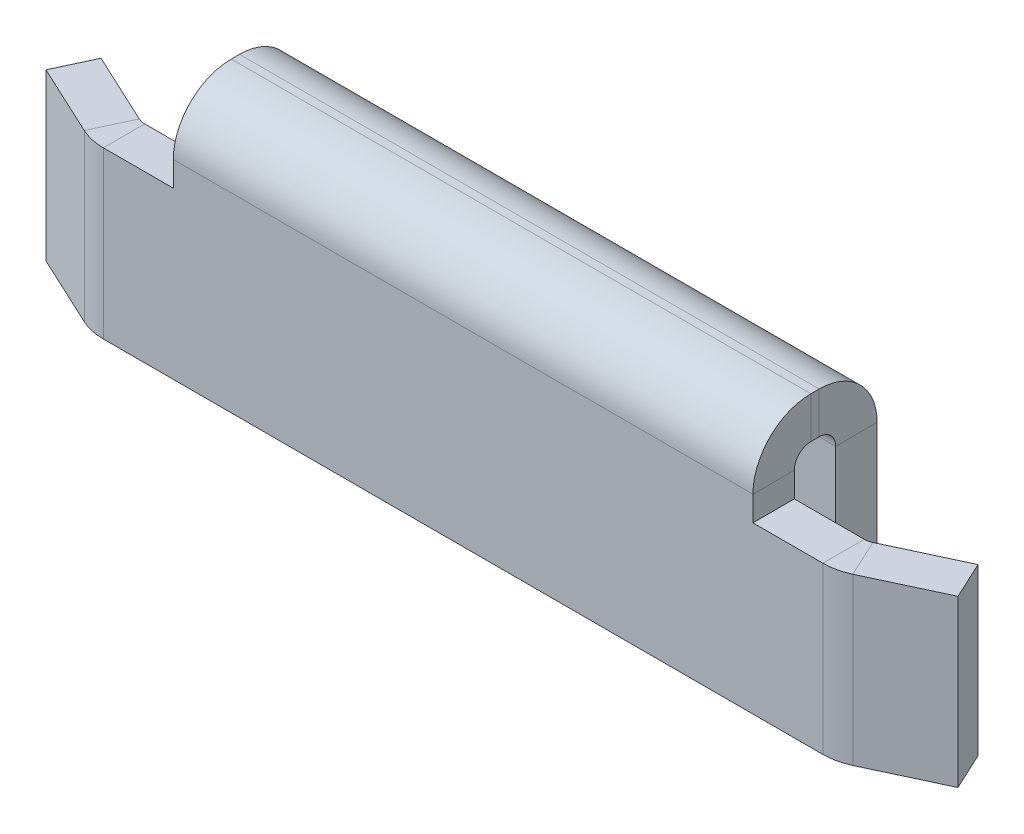
ISO-10303-21;
HEADER;
FILE_DESCRIPTION(('STEP AP214'),'2;1');
FILE_NAME('part.step','',(''),(''),'','','');
FILE_SCHEMA(('AUTOMOTIVE_DESIGN { 1 0 10303 214 1 1 1 1 }'));
ENDSEC;
DATA;
#1=APPLICATION_CONTEXT('core data for automotive mechanical design processes');
#2=APPLICATION_PROTOCOL_DEFINITION('international standard','automotive_design',2000,#1);
#3=PRODUCT_CONTEXT('',#1,'mechanical');
#4=PRODUCT('Part','Part','',(#3));
#5=PRODUCT_RELATED_PRODUCT_CATEGORY('part','',(#4));
#6=PRODUCT_DEFINITION_FORMATION('','',#4);
#7=PRODUCT_DEFINITION_CONTEXT('part definition',#1,'design');
#8=PRODUCT_DEFINITION('design','',#6,#7);
#9=PRODUCT_DEFINITION_SHAPE('','',#8);
#10=(LENGTH_UNIT() NAMED_UNIT(*) SI_UNIT(.MILLI.,.METRE.));
#11=(NAMED_UNIT(*) PLANE_ANGLE_UNIT() SI_UNIT($,.RADIAN.));
#12=(NAMED_UNIT(*) SI_UNIT($,.STERADIAN.) SOLID_ANGLE_UNIT());
#13=UNCERTAINTY_MEASURE_WITH_UNIT(LENGTH_MEASURE(1.E-05),#10,'distance_accuracy_value','');
#14=(GEOMETRIC_REPRESENTATION_CONTEXT(3) GLOBAL_UNCERTAINTY_ASSIGNED_CONTEXT((#13)) GLOBAL_UNIT_ASSIGNED_CONTEXT((#10,
#11,#12)) REPRESENTATION_CONTEXT('',''));
#15=CARTESIAN_POINT('',(0.,0.,0.));
#16=DIRECTION('',(0.,0.,1.));
#17=DIRECTION('',(1.,0.,0.));
#18=AXIS2_PLACEMENT_3D('',#15,#16,#17);
#19=CARTESIAN_POINT('',(-44.45,31.75,-12.7));
#20=DIRECTION('',(-1.,0.,0.));
#21=DIRECTION('',(0.,0.,1.));
#22=AXIS2_PLACEMENT_3D('',#19,#20,#21);
#23=PLANE('',#22);
#24=DIRECTION('',(0.,-1.,0.));
#25=VECTOR('',#24,1.);
#26=CARTESIAN_POINT('',(-44.45,31.75,-2.54));
#27=LINE('',#26,#25);
#28=CARTESIAN_POINT('',(-44.45,38.1,-2.54000000000001));
#29=VERTEX_POINT('',#28);
#30=CARTESIAN_POINT('',(-44.45,31.75,-2.54000000000002));
#31=VERTEX_POINT('',#30);
#32=EDGE_CURVE('E419',#29,#31,#27,.T.);
#33=ORIENTED_EDGE('',*,*,#32,.F.);
#34=DIRECTION('',(0.,0.,1.));
#35=VECTOR('',#34,1.);
#36=CARTESIAN_POINT('',(-44.45,38.1,-12.7));
#37=LINE('',#36,#35);
#38=CARTESIAN_POINT('',(-44.45,38.1,-3.81));
#39=VERTEX_POINT('',#38);
#40=EDGE_CURVE('E353',#39,#29,#37,.T.);
#41=ORIENTED_EDGE('',*,*,#40,.F.);
#42=DIRECTION('',(0.,-1.,0.));
#43=VECTOR('',#42,1.);
#44=CARTESIAN_POINT('',(-44.45,31.75,-3.81));
#45=LINE('',#44,#43);
#46=CARTESIAN_POINT('',(-44.45,31.75,-3.81));
#47=VERTEX_POINT('',#46);
#48=EDGE_CURVE('E437',#39,#47,#45,.T.);
#49=ORIENTED_EDGE('',*,*,#48,.T.);
#50=DIRECTION('',(0.,0.,1.));
#51=VECTOR('',#50,1.);
#52=CARTESIAN_POINT('',(-44.45,31.75,-12.7));
#53=LINE('',#52,#51);
#54=EDGE_CURVE('E400',#47,#31,#53,.T.);
#55=ORIENTED_EDGE('',*,*,#54,.T.);
#56=EDGE_LOOP('',(#33,#41,#49,#55));
#57=FACE_BOUND('',#56,.T.);
#58=ADVANCED_FACE('F36',(#57),#23,.T.);
#59=CARTESIAN_POINT('',(44.45,31.75,-12.7));
#60=DIRECTION('',(-1.,0.,0.));
#61=DIRECTION('',(0.,0.,1.));
#62=AXIS2_PLACEMENT_3D('',#59,#60,#61);
#63=PLANE('',#62);
#64=DIRECTION('',(0.,-1.,0.));
#65=VECTOR('',#64,1.);
#66=CARTESIAN_POINT('',(44.45,31.75,-3.81));
#67=LINE('',#66,#65);
#68=CARTESIAN_POINT('',(44.45,38.1,-3.81));
#69=VERTEX_POINT('',#68);
#70=CARTESIAN_POINT('',(44.4499999999999,31.75,-3.81000000000001));
#71=VERTEX_POINT('',#70);
#72=EDGE_CURVE('E443',#69,#71,#67,.T.);
#73=ORIENTED_EDGE('',*,*,#72,.F.);
#74=DIRECTION('',(0.,0.,1.));
#75=VECTOR('',#74,1.);
#76=CARTESIAN_POINT('',(44.45,38.1,-12.7));
#77=LINE('',#76,#75);
#78=CARTESIAN_POINT('',(44.4499999999999,38.1,-2.53999999999998));
#79=VERTEX_POINT('',#78);
#80=EDGE_CURVE('E404',#69,#79,#77,.T.);
#81=ORIENTED_EDGE('',*,*,#80,.T.);
#82=DIRECTION('',(0.,-1.,0.));
#83=VECTOR('',#82,1.);
#84=CARTESIAN_POINT('',(44.45,31.75,-2.54));
#85=LINE('',#84,#83);
#86=CARTESIAN_POINT('',(44.4499999999999,31.75,-2.54));
#87=VERTEX_POINT('',#86);
#88=EDGE_CURVE('E414',#79,#87,#85,.T.);
#89=ORIENTED_EDGE('',*,*,#88,.T.);
#90=DIRECTION('',(0.,0.,1.));
#91=VECTOR('',#90,1.);
#92=CARTESIAN_POINT('',(44.45,31.75,-12.7));
#93=LINE('',#92,#91);
#94=EDGE_CURVE('E403',#71,#87,#93,.T.);
#95=ORIENTED_EDGE('',*,*,#94,.F.);
#96=EDGE_LOOP('',(#73,#81,#89,#95));
#97=FACE_BOUND('',#96,.T.);
#98=ADVANCED_FACE('F501',(#97),#63,.F.);
#99=CARTESIAN_POINT('',(-44.45,31.75,-12.7));
#100=DIRECTION('',(0.,1.,0.));
#101=DIRECTION('',(-1.,0.,0.));
#102=AXIS2_PLACEMENT_3D('',#99,#100,#101);
#103=PLANE('',#102);
#104=ORIENTED_EDGE('',*,*,#54,.F.);
#105=DIRECTION('',(1.,0.,0.));
#106=VECTOR('',#105,1.);
#107=CARTESIAN_POINT('',(44.45,31.75,-3.81));
#108=LINE('',#107,#106);
#109=EDGE_CURVE('E434',#47,#71,#108,.T.);
#110=ORIENTED_EDGE('',*,*,#109,.T.);
#111=ORIENTED_EDGE('',*,*,#94,.T.);
#112=DIRECTION('',(-1.,0.,0.));
#113=VECTOR('',#112,1.);
#114=CARTESIAN_POINT('',(-44.45,31.75,-2.54));
#115=LINE('',#114,#113);
#116=EDGE_CURVE('E407',#87,#31,#115,.T.);
#117=ORIENTED_EDGE('',*,*,#116,.T.);
#118=EDGE_LOOP('',(#104,#110,#111,#117));
#119=FACE_BOUND('',#118,.T.);
#120=ADVANCED_FACE('F496',(#119),#103,.F.);
#121=CARTESIAN_POINT('',(-44.45,38.1,-12.7));
#122=DIRECTION('',(0.,1.,0.));
#123=DIRECTION('',(-1.,0.,0.));
#124=AXIS2_PLACEMENT_3D('',#121,#122,#123);
#125=PLANE('',#124);
#126=ORIENTED_EDGE('',*,*,#40,.T.);
#127=DIRECTION('',(-1.,0.,0.));
#128=VECTOR('',#127,1.);
#129=CARTESIAN_POINT('',(-44.45,38.1,-2.54));
#130=LINE('',#129,#128);
#131=EDGE_CURVE('E417',#79,#29,#130,.T.);
#132=ORIENTED_EDGE('',*,*,#131,.F.);
#133=ORIENTED_EDGE('',*,*,#80,.F.);
#134=DIRECTION('',(1.,0.,0.));
#135=VECTOR('',#134,1.);
#136=CARTESIAN_POINT('',(-44.45,38.1,-3.81));
#137=LINE('',#136,#135);
#138=EDGE_CURVE('E440',#39,#69,#137,.T.);
#139=ORIENTED_EDGE('',*,*,#138,.F.);
#140=EDGE_LOOP('',(#126,#132,#133,#139));
#141=FACE_BOUND('',#140,.T.);
#142=ADVANCED_FACE('F487',(#141),#125,.T.);
#143=CARTESIAN_POINT('',(55.7422388922173,25.4,0.));
#144=DIRECTION('',(0.,1.,0.));
#145=DIRECTION('',(-1.,0.,0.));
#146=AXIS2_PLACEMENT_3D('',#143,#144,#145);
#147=PLANE('',#146);
#148=DIRECTION('',(0.,0.,-1.));
#149=VECTOR('',#148,1.);
#150=CARTESIAN_POINT('',(44.45,25.4,0.));
#151=LINE('',#150,#149);
#152=CARTESIAN_POINT('',(44.45,25.4,6.35));
#153=VERTEX_POINT('',#152);
#154=CARTESIAN_POINT('',(44.45,25.4,0.));
#155=VERTEX_POINT('',#154);
#156=EDGE_CURVE('E365',#153,#155,#151,.T.);
#157=ORIENTED_EDGE('',*,*,#156,.F.);
#158=DIRECTION('',(1.,0.,0.));
#159=VECTOR('',#158,1.);
#160=CARTESIAN_POINT('',(55.7422388922173,25.4,6.35));
#161=LINE('',#160,#159);
#162=CARTESIAN_POINT('',(55.1791344491043,25.4,6.35));
#163=VERTEX_POINT('',#162);
#164=EDGE_CURVE('E58',#163,#153,#161,.F.);
#165=ORIENTED_EDGE('',*,*,#164,.F.);
#166=DIRECTION('',(0.,0.,-1.));
#167=VECTOR('',#166,1.);
#168=CARTESIAN_POINT('',(55.1791344491043,25.4,0.));
#169=LINE('',#168,#167);
#170=CARTESIAN_POINT('',(55.1791344491043,25.4,0.));
#171=VERTEX_POINT('',#170);
#172=EDGE_CURVE('E449',#163,#171,#169,.T.);
#173=ORIENTED_EDGE('',*,*,#172,.T.);
#174=DIRECTION('',(-1.,0.,0.));
#175=VECTOR('',#174,1.);
#176=CARTESIAN_POINT('',(55.7422388922173,25.4,0.));
#177=LINE('',#176,#175);
#178=EDGE_CURVE('E391',#171,#155,#177,.T.);
#179=ORIENTED_EDGE('',*,*,#178,.T.);
#180=EDGE_LOOP('',(#157,#165,#173,#179));
#181=FACE_BOUND('',#180,.T.);
#182=ADVANCED_FACE('F484',(#181),#147,.T.);
#183=CARTESIAN_POINT('',(55.7422388922173,25.4,0.));
#184=DIRECTION('',(0.,1.,0.));
#185=DIRECTION('',(-1.,0.,0.));
#186=AXIS2_PLACEMENT_3D('',#183,#184,#185);
#187=PLANE('',#186);
#188=DIRECTION('',(0.,0.,-1.));
#189=VECTOR('',#188,1.);
#190=CARTESIAN_POINT('',(-55.1791344491042,25.4,0.));
#191=LINE('',#190,#189);
#192=CARTESIAN_POINT('',(-55.1791344491042,25.4,6.35));
#193=VERTEX_POINT('',#192);
#194=CARTESIAN_POINT('',(-55.1791344491042,25.4,0.));
#195=VERTEX_POINT('',#194);
#196=EDGE_CURVE('E431',#193,#195,#191,.T.);
#197=ORIENTED_EDGE('',*,*,#196,.F.);
#198=DIRECTION('',(1.,0.,0.));
#199=VECTOR('',#198,1.);
#200=CARTESIAN_POINT('',(55.7422388922173,25.4,6.35));
#201=LINE('',#200,#199);
#202=CARTESIAN_POINT('',(-44.45,25.4,6.35));
#203=VERTEX_POINT('',#202);
#204=EDGE_CURVE('E359',#203,#193,#201,.F.);
#205=ORIENTED_EDGE('',*,*,#204,.F.);
#206=DIRECTION('',(0.,0.,-1.));
#207=VECTOR('',#206,1.);
#208=CARTESIAN_POINT('',(-44.4499999999999,25.4,0.));
#209=LINE('',#208,#207);
#210=CARTESIAN_POINT('',(-44.4499999999999,25.4,0.));
#211=VERTEX_POINT('',#210);
#212=EDGE_CURVE('E385',#203,#211,#209,.T.);
#213=ORIENTED_EDGE('',*,*,#212,.T.);
#214=EDGE_CURVE('E383',#211,#195,#177,.T.);
#215=ORIENTED_EDGE('',*,*,#214,.T.);
#216=EDGE_LOOP('',(#197,#205,#213,#215));
#217=FACE_BOUND('',#216,.T.);
#218=ADVANCED_FACE('F486',(#217),#187,.T.);
#219=CARTESIAN_POINT('',(55.7422388922173,0.,0.));
#220=DIRECTION('',(0.,1.,0.));
#221=DIRECTION('',(-1.,0.,0.));
#222=AXIS2_PLACEMENT_3D('',#219,#220,#221);
#223=PLANE('',#222);
#224=DIRECTION('',(0.,0.,-1.));
#225=VECTOR('',#224,1.);
#226=CARTESIAN_POINT('',(55.1791344491043,0.,0.));
#227=LINE('',#226,#225);
#228=CARTESIAN_POINT('',(55.1791344491043,0.,6.35));
#229=VERTEX_POINT('',#228);
#230=CARTESIAN_POINT('',(55.1791344491043,0.,0.));
#231=VERTEX_POINT('',#230);
#232=EDGE_CURVE('E11',#229,#231,#227,.T.);
#233=ORIENTED_EDGE('',*,*,#232,.F.);
#234=DIRECTION('',(1.,0.,0.));
#235=VECTOR('',#234,1.);
#236=CARTESIAN_POINT('',(55.7422388922173,0.,6.35));
#237=LINE('',#236,#235);
#238=CARTESIAN_POINT('',(-55.1791344491042,0.,6.35));
#239=VERTEX_POINT('',#238);
#240=EDGE_CURVE('E50',#229,#239,#237,.F.);
#241=ORIENTED_EDGE('',*,*,#240,.T.);
#242=DIRECTION('',(0.,0.,-1.));
#243=VECTOR('',#242,1.);
#244=CARTESIAN_POINT('',(-55.1791344491042,0.,0.));
#245=LINE('',#244,#243);
#246=CARTESIAN_POINT('',(-55.1791344491042,0.,0.));
#247=VERTEX_POINT('',#246);
#248=EDGE_CURVE('E425',#239,#247,#245,.T.);
#249=ORIENTED_EDGE('',*,*,#248,.T.);
#250=DIRECTION('',(-1.,0.,0.));
#251=VECTOR('',#250,1.);
#252=CARTESIAN_POINT('',(55.7422388922173,0.,0.));
#253=LINE('',#252,#251);
#254=EDGE_CURVE('E380',#231,#247,#253,.T.);
#255=ORIENTED_EDGE('',*,*,#254,.F.);
#256=EDGE_LOOP('',(#233,#241,#249,#255));
#257=FACE_BOUND('',#256,.T.);
#258=ADVANCED_FACE('F493',(#257),#223,.F.);
#259=CARTESIAN_POINT('',(55.7422388922173,25.4,0.));
#260=DIRECTION('',(0.,0.,1.));
#261=DIRECTION('',(1.,0.,0.));
#262=AXIS2_PLACEMENT_3D('',#259,#260,#261);
#263=PLANE('',#262);
#264=ORIENTED_EDGE('',*,*,#254,.T.);
#265=DIRECTION('',(0.,1.,0.));
#266=VECTOR('',#265,1.);
#267=CARTESIAN_POINT('',(-55.1791344491043,25.4,0.));
#268=LINE('',#267,#266);
#269=EDGE_CURVE('E422',#247,#195,#268,.T.);
#270=ORIENTED_EDGE('',*,*,#269,.T.);
#271=ORIENTED_EDGE('',*,*,#214,.F.);
#272=DIRECTION('',(0.,-1.,0.));
#273=VECTOR('',#272,1.);
#274=CARTESIAN_POINT('',(-44.45,38.1,0.));
#275=LINE('',#274,#273);
#276=CARTESIAN_POINT('',(-44.45,29.21,0.));
#277=VERTEX_POINT('',#276);
#278=EDGE_CURVE('E350',#277,#211,#275,.T.);
#279=ORIENTED_EDGE('',*,*,#278,.F.);
#280=DIRECTION('',(1.,0.,0.));
#281=VECTOR('',#280,1.);
#282=CARTESIAN_POINT('',(44.45,29.21,0.));
#283=LINE('',#282,#281);
#284=CARTESIAN_POINT('',(44.4499999999999,29.21,0.));
#285=VERTEX_POINT('',#284);
#286=EDGE_CURVE('E375',#277,#285,#283,.T.);
#287=ORIENTED_EDGE('',*,*,#286,.T.);
#288=DIRECTION('',(0.,-1.,0.));
#289=VECTOR('',#288,1.);
#290=CARTESIAN_POINT('',(44.45,38.1,0.));
#291=LINE('',#290,#289);
#292=EDGE_CURVE('E372',#285,#155,#291,.T.);
#293=ORIENTED_EDGE('',*,*,#292,.T.);
#294=ORIENTED_EDGE('',*,*,#178,.F.);
#295=DIRECTION('',(0.,-1.,0.));
#296=VECTOR('',#295,1.);
#297=CARTESIAN_POINT('',(55.1791344491043,0.,0.));
#298=LINE('',#297,#296);
#299=EDGE_CURVE('E446',#171,#231,#298,.T.);
#300=ORIENTED_EDGE('',*,*,#299,.T.);
#301=EDGE_LOOP('',(#264,#270,#271,#279,#287,#293,#294,#300));
#302=FACE_BOUND('',#301,.T.);
#303=ADVANCED_FACE('F483',(#302),#263,.F.);
#304=CARTESIAN_POINT('',(44.45,38.1,0.));
#305=DIRECTION('',(-1.,0.,0.));
#306=DIRECTION('',(0.,-1.,0.));
#307=AXIS2_PLACEMENT_3D('',#304,#305,#306);
#308=PLANE('',#307);
#309=DIRECTION('',(0.,0.,-1.));
#310=VECTOR('',#309,1.);
#311=CARTESIAN_POINT('',(44.45,29.21,0.));
#312=LINE('',#311,#310);
#313=CARTESIAN_POINT('',(44.45,29.21,6.35));
#314=VERTEX_POINT('',#313);
#315=EDGE_CURVE('E394',#314,#285,#312,.T.);
#316=ORIENTED_EDGE('',*,*,#315,.F.);
#317=DIRECTION('',(0.,1.,0.));
#318=VECTOR('',#317,1.);
#319=CARTESIAN_POINT('',(44.45,25.4,6.35));
#320=LINE('',#319,#318);
#321=EDGE_CURVE('E367',#314,#153,#320,.F.);
#322=ORIENTED_EDGE('',*,*,#321,.T.);
#323=ORIENTED_EDGE('',*,*,#156,.T.);
#324=ORIENTED_EDGE('',*,*,#292,.F.);
#325=EDGE_LOOP('',(#316,#322,#323,#324));
#326=FACE_BOUND('',#325,.T.);
#327=ADVANCED_FACE('F524',(#326),#308,.F.);
#328=CARTESIAN_POINT('',(55.7422388922173,25.4,6.35));
#329=DIRECTION('',(0.,0.,1.));
#330=DIRECTION('',(1.,0.,0.));
#331=AXIS2_PLACEMENT_3D('',#328,#329,#330);
#332=PLANE('',#331);
#333=ORIENTED_EDGE('',*,*,#240,.F.);
#334=DIRECTION('',(0.,-1.,0.));
#335=VECTOR('',#334,1.);
#336=CARTESIAN_POINT('',(55.1791344491043,25.4,6.35));
#337=LINE('',#336,#335);
#338=EDGE_CURVE('E43',#163,#229,#337,.T.);
#339=ORIENTED_EDGE('',*,*,#338,.F.);
#340=ORIENTED_EDGE('',*,*,#164,.T.);
#341=ORIENTED_EDGE('',*,*,#321,.F.);
#342=DIRECTION('',(1.,0.,0.));
#343=VECTOR('',#342,1.);
#344=CARTESIAN_POINT('',(55.7422388922173,29.21,6.35));
#345=LINE('',#344,#343);
#346=CARTESIAN_POINT('',(-44.45,29.21,6.35));
#347=VERTEX_POINT('',#346);
#348=EDGE_CURVE('E345',#347,#314,#345,.T.);
#349=ORIENTED_EDGE('',*,*,#348,.F.);
#350=DIRECTION('',(0.,1.,0.));
#351=VECTOR('',#350,1.);
#352=CARTESIAN_POINT('',(-44.45,25.4,6.35));
#353=LINE('',#352,#351);
#354=EDGE_CURVE('E361',#347,#203,#353,.F.);
#355=ORIENTED_EDGE('',*,*,#354,.T.);
#356=ORIENTED_EDGE('',*,*,#204,.T.);
#357=DIRECTION('',(0.,1.,0.));
#358=VECTOR('',#357,1.);
#359=CARTESIAN_POINT('',(-55.1791344491042,25.4,6.35));
#360=LINE('',#359,#358);
#361=EDGE_CURVE('E428',#239,#193,#360,.T.);
#362=ORIENTED_EDGE('',*,*,#361,.F.);
#363=EDGE_LOOP('',(#333,#339,#340,#341,#349,#355,#356,#362));
#364=FACE_BOUND('',#363,.T.);
#365=ADVANCED_FACE('F622',(#364),#332,.T.);
#366=CARTESIAN_POINT('',(-44.45,38.1,0.));
#367=DIRECTION('',(-1.,0.,0.));
#368=DIRECTION('',(0.,-1.,0.));
#369=AXIS2_PLACEMENT_3D('',#366,#367,#368);
#370=PLANE('',#369);
#371=ORIENTED_EDGE('',*,*,#212,.F.);
#372=ORIENTED_EDGE('',*,*,#354,.F.);
#373=DIRECTION('',(0.,0.,-1.));
#374=VECTOR('',#373,1.);
#375=CARTESIAN_POINT('',(-44.45,29.21,0.));
#376=LINE('',#375,#374);
#377=EDGE_CURVE('E354',#347,#277,#376,.T.);
#378=ORIENTED_EDGE('',*,*,#377,.T.);
#379=ORIENTED_EDGE('',*,*,#278,.T.);
#380=EDGE_LOOP('',(#371,#372,#378,#379));
#381=FACE_BOUND('',#380,.T.);
#382=ADVANCED_FACE('F527',(#381),#370,.T.);
#383=CARTESIAN_POINT('',(-44.45,29.21,-2.54));
#384=DIRECTION('',(1.,0.,0.));
#385=DIRECTION('',(0.,0.,-1.));
#386=AXIS2_PLACEMENT_3D('',#383,#384,#385);
#387=PLANE('',#386);
#388=ORIENTED_EDGE('',*,*,#377,.F.);
#389=CARTESIAN_POINT('',(-44.45,29.21,-2.54));
#390=DIRECTION('',(1.,0.,0.));
#391=DIRECTION('',(0.,1.,0.));
#392=AXIS2_PLACEMENT_3D('',#389,#390,#391);
#393=CIRCLE('',#392,8.89);
#394=EDGE_CURVE('E334',#347,#29,#393,.F.);
#395=ORIENTED_EDGE('',*,*,#394,.T.);
#396=ORIENTED_EDGE('',*,*,#32,.T.);
#397=CARTESIAN_POINT('',(-44.45,29.21,-2.54));
#398=DIRECTION('',(-1.,0.,0.));
#399=DIRECTION('',(0.,0.,1.));
#400=AXIS2_PLACEMENT_3D('',#397,#398,#399);
#401=CIRCLE('',#400,2.54);
#402=EDGE_CURVE('E339',#277,#31,#401,.T.);
#403=ORIENTED_EDGE('',*,*,#402,.F.);
#404=EDGE_LOOP('',(#388,#395,#396,#403));
#405=FACE_BOUND('',#404,.T.);
#406=ADVANCED_FACE('F512',(#405),#387,.F.);
#407=CARTESIAN_POINT('',(44.4499999999999,29.21,-2.54));
#408=DIRECTION('',(-1.,0.,0.));
#409=DIRECTION('',(0.,0.,1.));
#410=AXIS2_PLACEMENT_3D('',#407,#408,#409);
#411=PLANE('',#410);
#412=ORIENTED_EDGE('',*,*,#88,.F.);
#413=CARTESIAN_POINT('',(44.4499999999999,29.21,-2.54));
#414=DIRECTION('',(1.,0.,0.));
#415=DIRECTION('',(0.,1.,0.));
#416=AXIS2_PLACEMENT_3D('',#413,#414,#415);
#417=CIRCLE('',#416,8.89);
#418=EDGE_CURVE('E342',#79,#314,#417,.T.);
#419=ORIENTED_EDGE('',*,*,#418,.T.);
#420=ORIENTED_EDGE('',*,*,#315,.T.);
#421=CARTESIAN_POINT('',(44.4499999999999,29.21,-2.54));
#422=DIRECTION('',(1.,0.,0.));
#423=DIRECTION('',(0.,0.,-1.));
#424=AXIS2_PLACEMENT_3D('',#421,#422,#423);
#425=CIRCLE('',#424,2.54);
#426=EDGE_CURVE('E341',#87,#285,#425,.T.);
#427=ORIENTED_EDGE('',*,*,#426,.F.);
#428=EDGE_LOOP('',(#412,#419,#420,#427));
#429=FACE_BOUND('',#428,.T.);
#430=ADVANCED_FACE('F520',(#429),#411,.F.);
#431=CARTESIAN_POINT('',(-89.5774572227926,29.21,-2.54));
#432=DIRECTION('',(1.,0.,0.));
#433=DIRECTION('',(0.,1.,0.));
#434=AXIS2_PLACEMENT_3D('',#431,#432,#433);
#435=CYLINDRICAL_SURFACE('',#434,2.54);
#436=ORIENTED_EDGE('',*,*,#426,.T.);
#437=ORIENTED_EDGE('',*,*,#286,.F.);
#438=ORIENTED_EDGE('',*,*,#402,.T.);
#439=ORIENTED_EDGE('',*,*,#116,.F.);
#440=EDGE_LOOP('',(#436,#437,#438,#439));
#441=FACE_BOUND('',#440,.T.);
#442=ADVANCED_FACE('F518',(#441),#435,.F.);
#443=CARTESIAN_POINT('',(-89.5774572227926,29.21,-2.54));
#444=DIRECTION('',(1.,0.,0.));
#445=DIRECTION('',(0.,1.,0.));
#446=AXIS2_PLACEMENT_3D('',#443,#444,#445);
#447=CYLINDRICAL_SURFACE('',#446,8.89);
#448=ORIENTED_EDGE('',*,*,#418,.F.);
#449=ORIENTED_EDGE('',*,*,#131,.T.);
#450=ORIENTED_EDGE('',*,*,#394,.F.);
#451=ORIENTED_EDGE('',*,*,#348,.T.);
#452=EDGE_LOOP('',(#448,#449,#450,#451));
#453=FACE_BOUND('',#452,.T.);
#454=ADVANCED_FACE('F530',(#453),#447,.T.);
#455=CARTESIAN_POINT('',(-55.1791344491043,0.,-2.54));
#456=DIRECTION('',(0.,1.,0.));
#457=DIRECTION('',(-1.,0.,0.));
#458=AXIS2_PLACEMENT_3D('',#455,#456,#457);
#459=PLANE('',#458);
#460=ORIENTED_EDGE('',*,*,#248,.F.);
#461=CARTESIAN_POINT('',(-55.1791344491043,0.,-2.54));
#462=DIRECTION('',(0.,1.,0.));
#463=DIRECTION('',(0.,0.,1.));
#464=AXIS2_PLACEMENT_3D('',#461,#462,#463);
#465=CIRCLE('',#464,8.89);
#466=CARTESIAN_POINT('',(-58.9362107959791,0.,5.51707622675582));
#467=VERTEX_POINT('',#466);
#468=EDGE_CURVE('E298',#239,#467,#465,.F.);
#469=ORIENTED_EDGE('',*,*,#468,.T.);
#470=DIRECTION('',(0.4226182617407,0.,-0.90630778703665));
#471=VECTOR('',#470,1.);
#472=CARTESIAN_POINT('',(-56.2525848339256,0.,-0.237978220926909));
#473=LINE('',#472,#471);
#474=CARTESIAN_POINT('',(-56.2525848339257,0.,-0.237978220926936));
#475=VERTEX_POINT('',#474);
#476=EDGE_CURVE('E322',#467,#475,#473,.T.);
#477=ORIENTED_EDGE('',*,*,#476,.T.);
#478=CARTESIAN_POINT('',(-55.1791344491043,0.,-2.54));
#479=DIRECTION('',(0.,-1.,0.));
#480=DIRECTION('',(1.,0.,0.));
#481=AXIS2_PLACEMENT_3D('',#478,#479,#480);
#482=CIRCLE('',#481,2.54);
#483=EDGE_CURVE('E327',#247,#475,#482,.T.);
#484=ORIENTED_EDGE('',*,*,#483,.F.);
#485=EDGE_LOOP('',(#460,#469,#477,#484));
#486=FACE_BOUND('',#485,.T.);
#487=ADVANCED_FACE('F608',(#486),#459,.F.);
#488=CARTESIAN_POINT('',(-55.1791344491043,25.4,-2.54));
#489=DIRECTION('',(0.,-1.,0.));
#490=DIRECTION('',(0.,0.,-1.));
#491=AXIS2_PLACEMENT_3D('',#488,#489,#490);
#492=PLANE('',#491);
#493=DIRECTION('',(0.422618261740701,0.,-0.906307787036649));
#494=VECTOR('',#493,1.);
#495=CARTESIAN_POINT('',(-56.2525848339256,25.4,-0.237978220926909));
#496=LINE('',#495,#494);
#497=CARTESIAN_POINT('',(-58.9362107959791,25.4,5.51707622675582));
#498=VERTEX_POINT('',#497);
#499=CARTESIAN_POINT('',(-56.2525848339256,25.4,-0.2379782209269));
#500=VERTEX_POINT('',#499);
#501=EDGE_CURVE('E299',#498,#500,#496,.T.);
#502=ORIENTED_EDGE('',*,*,#501,.F.);
#503=CARTESIAN_POINT('',(-55.1791344491043,25.4,-2.54));
#504=DIRECTION('',(0.,1.,0.));
#505=DIRECTION('',(0.,0.,1.));
#506=AXIS2_PLACEMENT_3D('',#503,#504,#505);
#507=CIRCLE('',#506,8.89);
#508=EDGE_CURVE('E331',#498,#193,#507,.T.);
#509=ORIENTED_EDGE('',*,*,#508,.T.);
#510=ORIENTED_EDGE('',*,*,#196,.T.);
#511=CARTESIAN_POINT('',(-55.1791344491043,25.4,-2.54));
#512=DIRECTION('',(0.,1.,0.));
#513=DIRECTION('',(0.,0.,1.));
#514=AXIS2_PLACEMENT_3D('',#511,#512,#513);
#515=CIRCLE('',#514,2.54);
#516=EDGE_CURVE('E330',#500,#195,#515,.T.);
#517=ORIENTED_EDGE('',*,*,#516,.F.);
#518=EDGE_LOOP('',(#502,#509,#510,#517));
#519=FACE_BOUND('',#518,.T.);
#520=ADVANCED_FACE('F601',(#519),#492,.F.);
#521=CARTESIAN_POINT('',(-55.1791344491043,-13.6002041114534,-2.54));
#522=DIRECTION('',(0.,1.,0.));
#523=DIRECTION('',(0.,0.,1.));
#524=AXIS2_PLACEMENT_3D('',#521,#522,#523);
#525=CYLINDRICAL_SURFACE('',#524,2.54);
#526=ORIENTED_EDGE('',*,*,#516,.T.);
#527=ORIENTED_EDGE('',*,*,#269,.F.);
#528=ORIENTED_EDGE('',*,*,#483,.T.);
#529=DIRECTION('',(0.,-1.,0.));
#530=VECTOR('',#529,1.);
#531=CARTESIAN_POINT('',(-56.2525848339256,0.,-0.237978220926909));
#532=LINE('',#531,#530);
#533=EDGE_CURVE('E315',#500,#475,#532,.T.);
#534=ORIENTED_EDGE('',*,*,#533,.F.);
#535=EDGE_LOOP('',(#526,#527,#528,#534));
#536=FACE_BOUND('',#535,.T.);
#537=ADVANCED_FACE('F598',(#536),#525,.F.);
#538=CARTESIAN_POINT('',(-55.1791344491043,-13.6002041114534,-2.54));
#539=DIRECTION('',(0.,1.,0.));
#540=DIRECTION('',(0.,0.,1.));
#541=AXIS2_PLACEMENT_3D('',#538,#539,#540);
#542=CYLINDRICAL_SURFACE('',#541,8.89);
#543=ORIENTED_EDGE('',*,*,#508,.F.);
#544=DIRECTION('',(0.,-1.,0.));
#545=VECTOR('',#544,1.);
#546=CARTESIAN_POINT('',(-58.9362107959791,25.4,5.51707622675582));
#547=LINE('',#546,#545);
#548=EDGE_CURVE('E290',#498,#467,#547,.T.);
#549=ORIENTED_EDGE('',*,*,#548,.T.);
#550=ORIENTED_EDGE('',*,*,#468,.F.);
#551=ORIENTED_EDGE('',*,*,#361,.T.);
#552=EDGE_LOOP('',(#543,#549,#550,#551));
#553=FACE_BOUND('',#552,.T.);
#554=ADVANCED_FACE('F582',(#553),#542,.T.);
#555=CARTESIAN_POINT('',(-67.2523477875827,25.4,-5.36725192410689));
#556=DIRECTION('',(-0.90630778703665,0.,-0.4226182617407));
#557=DIRECTION('',(0.,-1.,0.));
#558=AXIS2_PLACEMENT_3D('',#555,#556,#557);
#559=PLANE('',#558);
#560=DIRECTION('',(0.4226182617407,0.,-0.90630778703665));
#561=VECTOR('',#560,1.);
#562=CARTESIAN_POINT('',(-67.2523477875827,0.,-5.36725192410689));
#563=LINE('',#562,#561);
#564=CARTESIAN_POINT('',(-69.9359737496362,0.,0.387802523575835));
#565=VERTEX_POINT('',#564);
#566=CARTESIAN_POINT('',(-67.2523477875827,0.,-5.36725192410689));
#567=VERTEX_POINT('',#566);
#568=EDGE_CURVE('E307',#565,#567,#563,.T.);
#569=ORIENTED_EDGE('',*,*,#568,.F.);
#570=DIRECTION('',(0.,1.,0.));
#571=VECTOR('',#570,1.);
#572=CARTESIAN_POINT('',(-69.9359737496362,25.4,0.387802523575835));
#573=LINE('',#572,#571);
#574=CARTESIAN_POINT('',(-69.9359737496362,25.4,0.387802523575835));
#575=VERTEX_POINT('',#574);
#576=EDGE_CURVE('E301',#575,#565,#573,.F.);
#577=ORIENTED_EDGE('',*,*,#576,.F.);
#578=DIRECTION('',(0.4226182617407,0.,-0.90630778703665));
#579=VECTOR('',#578,1.);
#580=CARTESIAN_POINT('',(-67.2523477875827,25.4,-5.36725192410689));
#581=LINE('',#580,#579);
#582=CARTESIAN_POINT('',(-67.2523477875827,25.4,-5.36725192410689));
#583=VERTEX_POINT('',#582);
#584=EDGE_CURVE('E320',#575,#583,#581,.T.);
#585=ORIENTED_EDGE('',*,*,#584,.T.);
#586=DIRECTION('',(0.,-1.,0.));
#587=VECTOR('',#586,1.);
#588=CARTESIAN_POINT('',(-67.2523477875827,25.4,-5.36725192410689));
#589=LINE('',#588,#587);
#590=EDGE_CURVE('E317',#583,#567,#589,.T.);
#591=ORIENTED_EDGE('',*,*,#590,.T.);
#592=EDGE_LOOP('',(#569,#577,#585,#591));
#593=FACE_BOUND('',#592,.T.);
#594=ADVANCED_FACE('F578',(#593),#559,.T.);
#595=CARTESIAN_POINT('',(-55.7422388922173,25.4,0.));
#596=DIRECTION('',(-0.4226182617407,0.,0.90630778703665));
#597=DIRECTION('',(0.90630778703665,0.,0.4226182617407));
#598=AXIS2_PLACEMENT_3D('',#595,#596,#597);
#599=PLANE('',#598);
#600=DIRECTION('',(-0.90630778703665,0.,-0.4226182617407));
#601=VECTOR('',#600,1.);
#602=CARTESIAN_POINT('',(-55.7422388922173,25.4,0.));
#603=LINE('',#602,#601);
#604=EDGE_CURVE('E295',#500,#583,#603,.T.);
#605=ORIENTED_EDGE('',*,*,#604,.F.);
#606=ORIENTED_EDGE('',*,*,#533,.T.);
#607=DIRECTION('',(-0.90630778703665,0.,-0.4226182617407));
#608=VECTOR('',#607,1.);
#609=CARTESIAN_POINT('',(-55.7422388922173,0.,0.));
#610=LINE('',#609,#608);
#611=EDGE_CURVE('E312',#475,#567,#610,.T.);
#612=ORIENTED_EDGE('',*,*,#611,.T.);
#613=ORIENTED_EDGE('',*,*,#590,.F.);
#614=EDGE_LOOP('',(#605,#606,#612,#613));
#615=FACE_BOUND('',#614,.T.);
#616=ADVANCED_FACE('F581',(#615),#599,.F.);
#617=CARTESIAN_POINT('',(-55.7422388922173,0.,0.));
#618=DIRECTION('',(0.,1.,0.));
#619=DIRECTION('',(-0.90630778703665,0.,-0.4226182617407));
#620=AXIS2_PLACEMENT_3D('',#617,#618,#619);
#621=PLANE('',#620);
#622=ORIENTED_EDGE('',*,*,#476,.F.);
#623=DIRECTION('',(0.90630778703665,0.,0.4226182617407));
#624=VECTOR('',#623,1.);
#625=CARTESIAN_POINT('',(-58.4258648542707,0.,5.75505444768273));
#626=LINE('',#625,#624);
#627=EDGE_CURVE('E309',#467,#565,#626,.F.);
#628=ORIENTED_EDGE('',*,*,#627,.T.);
#629=ORIENTED_EDGE('',*,*,#568,.T.);
#630=ORIENTED_EDGE('',*,*,#611,.F.);
#631=EDGE_LOOP('',(#622,#628,#629,#630));
#632=FACE_BOUND('',#631,.T.);
#633=ADVANCED_FACE('F586',(#632),#621,.F.);
#634=CARTESIAN_POINT('',(-58.4258648542707,25.4,5.75505444768273));
#635=DIRECTION('',(-0.4226182617407,0.,0.90630778703665));
#636=DIRECTION('',(0.90630778703665,0.,0.4226182617407));
#637=AXIS2_PLACEMENT_3D('',#634,#635,#636);
#638=PLANE('',#637);
#639=DIRECTION('',(0.90630778703665,0.,0.4226182617407));
#640=VECTOR('',#639,1.);
#641=CARTESIAN_POINT('',(-58.4258648542707,25.4,5.75505444768273));
#642=LINE('',#641,#640);
#643=EDGE_CURVE('E304',#498,#575,#642,.F.);
#644=ORIENTED_EDGE('',*,*,#643,.T.);
#645=ORIENTED_EDGE('',*,*,#576,.T.);
#646=ORIENTED_EDGE('',*,*,#627,.F.);
#647=ORIENTED_EDGE('',*,*,#548,.F.);
#648=EDGE_LOOP('',(#644,#645,#646,#647));
#649=FACE_BOUND('',#648,.T.);
#650=ADVANCED_FACE('F590',(#649),#638,.T.);
#651=CARTESIAN_POINT('',(-55.7422388922173,25.4,0.));
#652=DIRECTION('',(0.,1.,0.));
#653=DIRECTION('',(-0.90630778703665,0.,-0.4226182617407));
#654=AXIS2_PLACEMENT_3D('',#651,#652,#653);
#655=PLANE('',#654);
#656=ORIENTED_EDGE('',*,*,#584,.F.);
#657=ORIENTED_EDGE('',*,*,#643,.F.);
#658=ORIENTED_EDGE('',*,*,#501,.T.);
#659=ORIENTED_EDGE('',*,*,#604,.T.);
#660=EDGE_LOOP('',(#656,#657,#658,#659));
#661=FACE_BOUND('',#660,.T.);
#662=ADVANCED_FACE('F577',(#661),#655,.T.);
#663=CARTESIAN_POINT('',(-44.45,29.21,-3.81));
#664=DIRECTION('',(1.,0.,0.));
#665=DIRECTION('',(0.,0.,-1.));
#666=AXIS2_PLACEMENT_3D('',#663,#664,#665);
#667=PLANE('',#666);
#668=ORIENTED_EDGE('',*,*,#48,.F.);
#669=CARTESIAN_POINT('',(-44.45,29.21,-3.81));
#670=DIRECTION('',(1.,0.,0.));
#671=DIRECTION('',(0.,1.,0.));
#672=AXIS2_PLACEMENT_3D('',#669,#670,#671);
#673=CIRCLE('',#672,8.89);
#674=CARTESIAN_POINT('',(-44.45,29.21,-12.7));
#675=VERTEX_POINT('',#674);
#676=EDGE_CURVE('E243',#39,#675,#673,.F.);
#677=ORIENTED_EDGE('',*,*,#676,.T.);
#678=DIRECTION('',(0.,0.,1.));
#679=VECTOR('',#678,1.);
#680=CARTESIAN_POINT('',(-44.45,29.21,-6.35));
#681=LINE('',#680,#679);
#682=CARTESIAN_POINT('',(-44.45,29.21,-6.35));
#683=VERTEX_POINT('',#682);
#684=EDGE_CURVE('E278',#675,#683,#681,.T.);
#685=ORIENTED_EDGE('',*,*,#684,.T.);
#686=CARTESIAN_POINT('',(-44.45,29.21,-3.81));
#687=DIRECTION('',(-1.,0.,0.));
#688=DIRECTION('',(0.,0.,1.));
#689=AXIS2_PLACEMENT_3D('',#686,#687,#688);
#690=CIRCLE('',#689,2.54);
#691=EDGE_CURVE('E283',#47,#683,#690,.T.);
#692=ORIENTED_EDGE('',*,*,#691,.F.);
#693=EDGE_LOOP('',(#668,#677,#685,#692));
#694=FACE_BOUND('',#693,.T.);
#695=ADVANCED_FACE('F539',(#694),#667,.F.);
#696=CARTESIAN_POINT('',(44.4499999999999,29.21,-3.81));
#697=DIRECTION('',(-1.,0.,0.));
#698=DIRECTION('',(0.,0.,1.));
#699=AXIS2_PLACEMENT_3D('',#696,#697,#698);
#700=PLANE('',#699);
#701=DIRECTION('',(0.,0.,1.));
#702=VECTOR('',#701,1.);
#703=CARTESIAN_POINT('',(44.45,29.21,-6.35));
#704=LINE('',#703,#702);
#705=CARTESIAN_POINT('',(44.45,29.21,-12.7));
#706=VERTEX_POINT('',#705);
#707=CARTESIAN_POINT('',(44.4499999999999,29.21,-6.35));
#708=VERTEX_POINT('',#707);
#709=EDGE_CURVE('E241',#706,#708,#704,.T.);
#710=ORIENTED_EDGE('',*,*,#709,.F.);
#711=CARTESIAN_POINT('',(44.4499999999999,29.21,-3.81));
#712=DIRECTION('',(1.,0.,0.));
#713=DIRECTION('',(0.,1.,0.));
#714=AXIS2_PLACEMENT_3D('',#711,#712,#713);
#715=CIRCLE('',#714,8.89);
#716=EDGE_CURVE('E287',#706,#69,#715,.T.);
#717=ORIENTED_EDGE('',*,*,#716,.T.);
#718=ORIENTED_EDGE('',*,*,#72,.T.);
#719=CARTESIAN_POINT('',(44.4499999999999,29.21,-3.81));
#720=DIRECTION('',(1.,0.,0.));
#721=DIRECTION('',(0.,0.,-1.));
#722=AXIS2_PLACEMENT_3D('',#719,#720,#721);
#723=CIRCLE('',#722,2.54);
#724=EDGE_CURVE('E286',#708,#71,#723,.T.);
#725=ORIENTED_EDGE('',*,*,#724,.F.);
#726=EDGE_LOOP('',(#710,#717,#718,#725));
#727=FACE_BOUND('',#726,.T.);
#728=ADVANCED_FACE('F552',(#727),#700,.F.);
#729=CARTESIAN_POINT('',(-89.5774572227926,29.21,-3.81));
#730=DIRECTION('',(1.,0.,0.));
#731=DIRECTION('',(0.,1.,0.));
#732=AXIS2_PLACEMENT_3D('',#729,#730,#731);
#733=CYLINDRICAL_SURFACE('',#732,2.54);
#734=ORIENTED_EDGE('',*,*,#724,.T.);
#735=ORIENTED_EDGE('',*,*,#109,.F.);
#736=ORIENTED_EDGE('',*,*,#691,.T.);
#737=DIRECTION('',(-1.,0.,0.));
#738=VECTOR('',#737,1.);
#739=CARTESIAN_POINT('',(-44.45,29.21,-6.35));
#740=LINE('',#739,#738);
#741=EDGE_CURVE('E256',#708,#683,#740,.T.);
#742=ORIENTED_EDGE('',*,*,#741,.F.);
#743=EDGE_LOOP('',(#734,#735,#736,#742));
#744=FACE_BOUND('',#743,.T.);
#745=ADVANCED_FACE('F562',(#744),#733,.F.);
#746=CARTESIAN_POINT('',(-89.5774572227926,29.21,-3.81));
#747=DIRECTION('',(1.,0.,0.));
#748=DIRECTION('',(0.,1.,0.));
#749=AXIS2_PLACEMENT_3D('',#746,#747,#748);
#750=CYLINDRICAL_SURFACE('',#749,8.89);
#751=ORIENTED_EDGE('',*,*,#716,.F.);
#752=DIRECTION('',(-1.,0.,0.));
#753=VECTOR('',#752,1.);
#754=CARTESIAN_POINT('',(-44.45,29.21,-12.7));
#755=LINE('',#754,#753);
#756=EDGE_CURVE('E235',#706,#675,#755,.T.);
#757=ORIENTED_EDGE('',*,*,#756,.T.);
#758=ORIENTED_EDGE('',*,*,#676,.F.);
#759=ORIENTED_EDGE('',*,*,#138,.T.);
#760=EDGE_LOOP('',(#751,#757,#758,#759));
#761=FACE_BOUND('',#760,.T.);
#762=ADVANCED_FACE('F541',(#761),#750,.T.);
#763=CARTESIAN_POINT('',(-44.45,6.34999999999998,-6.35000000000001));
#764=DIRECTION('',(0.,-1.,0.));
#765=DIRECTION('',(-1.,0.,0.));
#766=AXIS2_PLACEMENT_3D('',#763,#764,#765);
#767=PLANE('',#766);
#768=DIRECTION('',(0.,0.,1.));
#769=VECTOR('',#768,1.);
#770=CARTESIAN_POINT('',(-44.45,6.34999999999998,-6.35000000000001));
#771=LINE('',#770,#769);
#772=CARTESIAN_POINT('',(-44.45,6.34999999999998,-12.7));
#773=VERTEX_POINT('',#772);
#774=CARTESIAN_POINT('',(-44.45,6.34999999999998,-6.35000000000001));
#775=VERTEX_POINT('',#774);
#776=EDGE_CURVE('E254',#773,#775,#771,.T.);
#777=ORIENTED_EDGE('',*,*,#776,.F.);
#778=DIRECTION('',(-1.,0.,0.));
#779=VECTOR('',#778,1.);
#780=CARTESIAN_POINT('',(-44.45,6.34999999999998,-12.7));
#781=LINE('',#780,#779);
#782=CARTESIAN_POINT('',(44.45,6.34999999999998,-12.7));
#783=VERTEX_POINT('',#782);
#784=EDGE_CURVE('E248',#783,#773,#781,.T.);
#785=ORIENTED_EDGE('',*,*,#784,.F.);
#786=DIRECTION('',(0.,0.,1.));
#787=VECTOR('',#786,1.);
#788=CARTESIAN_POINT('',(44.45,6.34999999999998,-6.35000000000001));
#789=LINE('',#788,#787);
#790=CARTESIAN_POINT('',(44.45,6.34999999999998,-6.35000000000001));
#791=VERTEX_POINT('',#790);
#792=EDGE_CURVE('E276',#783,#791,#789,.T.);
#793=ORIENTED_EDGE('',*,*,#792,.T.);
#794=DIRECTION('',(-1.,0.,0.));
#795=VECTOR('',#794,1.);
#796=CARTESIAN_POINT('',(-44.45,6.34999999999998,-6.35000000000001));
#797=LINE('',#796,#795);
#798=EDGE_CURVE('E273',#791,#775,#797,.T.);
#799=ORIENTED_EDGE('',*,*,#798,.T.);
#800=EDGE_LOOP('',(#777,#785,#793,#799));
#801=FACE_BOUND('',#800,.T.);
#802=ADVANCED_FACE('F569',(#801),#767,.T.);
#803=CARTESIAN_POINT('',(25.4,17.78,6.35102499999999));
#804=DIRECTION('',(0.,0.,-1.));
#805=DIRECTION('',(-1.,0.,0.));
#806=AXIS2_PLACEMENT_3D('',#803,#804,#805);
#807=CYLINDRICAL_SURFACE('',#806,1.63195);
#808=CARTESIAN_POINT('',(25.4,17.78,-12.7));
#809=DIRECTION('',(0.,0.,-1.));
#810=DIRECTION('',(-1.,0.,0.));
#811=AXIS2_PLACEMENT_3D('',#808,#809,#810);
#812=CIRCLE('',#811,1.63195);
#813=CARTESIAN_POINT('',(23.76805,17.78,-12.7));
#814=VERTEX_POINT('',#813);
#815=EDGE_CURVE('E270',#814,#814,#812,.T.);
#816=ORIENTED_EDGE('',*,*,#815,.T.);
#817=EDGE_LOOP('',(#816));
#818=FACE_BOUND('',#817,.T.);
#819=CARTESIAN_POINT('',(25.4,17.78,-6.35000000000002));
#820=DIRECTION('',(0.,0.,-1.));
#821=DIRECTION('',(-1.,0.,0.));
#822=AXIS2_PLACEMENT_3D('',#819,#820,#821);
#823=CIRCLE('',#822,1.63195);
#824=CARTESIAN_POINT('',(23.76805,17.78,-6.35000000000002));
#825=VERTEX_POINT('',#824);
#826=EDGE_CURVE('E267',#825,#825,#823,.F.);
#827=ORIENTED_EDGE('',*,*,#826,.T.);
#828=EDGE_LOOP('',(#827));
#829=FACE_BOUND('',#828,.T.);
#830=ADVANCED_FACE('F807',(#818,#829),#807,.F.);
#831=CARTESIAN_POINT('',(-25.4,17.78,6.35102499999999));
#832=DIRECTION('',(0.,0.,-1.));
#833=DIRECTION('',(-1.,0.,0.));
#834=AXIS2_PLACEMENT_3D('',#831,#832,#833);
#835=CYLINDRICAL_SURFACE('',#834,1.63195);
#836=CARTESIAN_POINT('',(-25.4,17.78,-12.7));
#837=DIRECTION('',(0.,0.,-1.));
#838=DIRECTION('',(1.,0.,0.));
#839=AXIS2_PLACEMENT_3D('',#836,#837,#838);
#840=CIRCLE('',#839,1.63195);
#841=CARTESIAN_POINT('',(-23.76805,17.78,-12.7));
#842=VERTEX_POINT('',#841);
#843=EDGE_CURVE('E264',#842,#842,#840,.T.);
#844=ORIENTED_EDGE('',*,*,#843,.T.);
#845=EDGE_LOOP('',(#844));
#846=FACE_BOUND('',#845,.T.);
#847=CARTESIAN_POINT('',(-25.4,17.78,-6.35));
#848=DIRECTION('',(0.,0.,-1.));
#849=DIRECTION('',(-1.,0.,0.));
#850=AXIS2_PLACEMENT_3D('',#847,#848,#849);
#851=CIRCLE('',#850,1.63195);
#852=CARTESIAN_POINT('',(-27.03195,17.78,-6.35));
#853=VERTEX_POINT('',#852);
#854=EDGE_CURVE('E261',#853,#853,#851,.F.);
#855=ORIENTED_EDGE('',*,*,#854,.T.);
#856=EDGE_LOOP('',(#855));
#857=FACE_BOUND('',#856,.T.);
#858=ADVANCED_FACE('F818',(#846,#857),#835,.F.);
#859=CARTESIAN_POINT('',(-44.45,6.34999999999998,-6.35000000000001));
#860=DIRECTION('',(0.,0.,-1.));
#861=DIRECTION('',(-1.,0.,0.));
#862=AXIS2_PLACEMENT_3D('',#859,#860,#861);
#863=PLANE('',#862);
#864=ORIENTED_EDGE('',*,*,#854,.F.);
#865=EDGE_LOOP('',(#864));
#866=FACE_BOUND('',#865,.T.);
#867=ORIENTED_EDGE('',*,*,#826,.F.);
#868=EDGE_LOOP('',(#867));
#869=FACE_BOUND('',#868,.T.);
#870=DIRECTION('',(0.,1.,0.));
#871=VECTOR('',#870,1.);
#872=CARTESIAN_POINT('',(44.45,6.34999999999998,-6.35000000000001));
#873=LINE('',#872,#871);
#874=EDGE_CURVE('E258',#791,#708,#873,.T.);
#875=ORIENTED_EDGE('',*,*,#874,.T.);
#876=ORIENTED_EDGE('',*,*,#741,.T.);
#877=DIRECTION('',(0.,1.,0.));
#878=VECTOR('',#877,1.);
#879=CARTESIAN_POINT('',(-44.45,6.34999999999998,-6.35000000000001));
#880=LINE('',#879,#878);
#881=EDGE_CURVE('E251',#775,#683,#880,.T.);
#882=ORIENTED_EDGE('',*,*,#881,.F.);
#883=ORIENTED_EDGE('',*,*,#798,.F.);
#884=EDGE_LOOP('',(#875,#876,#882,#883));
#885=FACE_BOUND('',#884,.T.);
#886=ADVANCED_FACE('F559',(#866,#869,#885),#863,.F.);
#887=CARTESIAN_POINT('',(-44.45,6.34999999999998,-6.35000000000001));
#888=DIRECTION('',(-1.,0.,0.));
#889=DIRECTION('',(0.,1.,0.));
#890=AXIS2_PLACEMENT_3D('',#887,#888,#889);
#891=PLANE('',#890);
#892=ORIENTED_EDGE('',*,*,#684,.F.);
#893=DIRECTION('',(0.,1.,0.));
#894=VECTOR('',#893,1.);
#895=CARTESIAN_POINT('',(-44.45,6.34999999999998,-12.7));
#896=LINE('',#895,#894);
#897=EDGE_CURVE('E246',#773,#675,#896,.T.);
#898=ORIENTED_EDGE('',*,*,#897,.F.);
#899=ORIENTED_EDGE('',*,*,#776,.T.);
#900=ORIENTED_EDGE('',*,*,#881,.T.);
#901=EDGE_LOOP('',(#892,#898,#899,#900));
#902=FACE_BOUND('',#901,.T.);
#903=ADVANCED_FACE('F839',(#902),#891,.T.);
#904=CARTESIAN_POINT('',(-44.45,6.34999999999998,-12.7));
#905=DIRECTION('',(0.,0.,-1.));
#906=DIRECTION('',(-1.,0.,0.));
#907=AXIS2_PLACEMENT_3D('',#904,#905,#906);
#908=PLANE('',#907);
#909=ORIENTED_EDGE('',*,*,#843,.F.);
#910=EDGE_LOOP('',(#909));
#911=FACE_BOUND('',#910,.T.);
#912=ORIENTED_EDGE('',*,*,#815,.F.);
#913=EDGE_LOOP('',(#912));
#914=FACE_BOUND('',#913,.T.);
#915=DIRECTION('',(0.,1.,0.));
#916=VECTOR('',#915,1.);
#917=CARTESIAN_POINT('',(44.45,6.34999999999998,-12.7));
#918=LINE('',#917,#916);
#919=EDGE_CURVE('E244',#783,#706,#918,.T.);
#920=ORIENTED_EDGE('',*,*,#919,.F.);
#921=ORIENTED_EDGE('',*,*,#784,.T.);
#922=ORIENTED_EDGE('',*,*,#897,.T.);
#923=ORIENTED_EDGE('',*,*,#756,.F.);
#924=EDGE_LOOP('',(#920,#921,#922,#923));
#925=FACE_BOUND('',#924,.T.);
#926=ADVANCED_FACE('F546',(#911,#914,#925),#908,.T.);
#927=CARTESIAN_POINT('',(44.45,6.34999999999998,-6.35000000000001));
#928=DIRECTION('',(-1.,0.,0.));
#929=DIRECTION('',(0.,1.,0.));
#930=AXIS2_PLACEMENT_3D('',#927,#928,#929);
#931=PLANE('',#930);
#932=ORIENTED_EDGE('',*,*,#792,.F.);
#933=ORIENTED_EDGE('',*,*,#919,.T.);
#934=ORIENTED_EDGE('',*,*,#709,.T.);
#935=ORIENTED_EDGE('',*,*,#874,.F.);
#936=EDGE_LOOP('',(#932,#933,#934,#935));
#937=FACE_BOUND('',#936,.T.);
#938=ADVANCED_FACE('F555',(#937),#931,.F.);
#939=CARTESIAN_POINT('',(55.1791344491043,0.,-2.54));
#940=DIRECTION('',(0.,1.,0.));
#941=DIRECTION('',(0.,0.,1.));
#942=AXIS2_PLACEMENT_3D('',#939,#940,#941);
#943=PLANE('',#942);
#944=DIRECTION('',(-0.422618261740701,0.,-0.906307787036649));
#945=VECTOR('',#944,1.);
#946=CARTESIAN_POINT('',(56.2525848339256,0.,-0.237978220926905));
#947=LINE('',#946,#945);
#948=CARTESIAN_POINT('',(58.9362107959791,0.,5.51707622675582));
#949=VERTEX_POINT('',#948);
#950=CARTESIAN_POINT('',(56.2525848339257,0.,-0.237978220926909));
#951=VERTEX_POINT('',#950);
#952=EDGE_CURVE('E216',#949,#951,#947,.T.);
#953=ORIENTED_EDGE('',*,*,#952,.F.);
#954=CARTESIAN_POINT('',(55.1791344491043,0.,-2.54));
#955=DIRECTION('',(0.,-1.,0.));
#956=DIRECTION('',(0.,0.,-1.));
#957=AXIS2_PLACEMENT_3D('',#954,#955,#956);
#958=CIRCLE('',#957,8.89);
#959=EDGE_CURVE('E238',#949,#229,#958,.T.);
#960=ORIENTED_EDGE('',*,*,#959,.T.);
#961=ORIENTED_EDGE('',*,*,#232,.T.);
#962=CARTESIAN_POINT('',(55.1791344491043,0.,-2.54));
#963=DIRECTION('',(0.,-1.,0.));
#964=DIRECTION('',(0.,0.,-1.));
#965=AXIS2_PLACEMENT_3D('',#962,#963,#964);
#966=CIRCLE('',#965,2.54);
#967=EDGE_CURVE('E228',#951,#231,#966,.T.);
#968=ORIENTED_EDGE('',*,*,#967,.F.);
#969=EDGE_LOOP('',(#953,#960,#961,#968));
#970=FACE_BOUND('',#969,.T.);
#971=ADVANCED_FACE('F457',(#970),#943,.F.);
#972=CARTESIAN_POINT('',(55.1791344491043,25.4,-2.54));
#973=DIRECTION('',(0.,-1.,0.));
#974=DIRECTION('',(0.,0.,-1.));
#975=AXIS2_PLACEMENT_3D('',#972,#973,#974);
#976=PLANE('',#975);
#977=ORIENTED_EDGE('',*,*,#172,.F.);
#978=CARTESIAN_POINT('',(55.1791344491043,25.4,-2.54));
#979=DIRECTION('',(0.,-1.,0.));
#980=DIRECTION('',(0.,0.,-1.));
#981=AXIS2_PLACEMENT_3D('',#978,#979,#980);
#982=CIRCLE('',#981,8.89);
#983=CARTESIAN_POINT('',(58.9362107959791,25.4,5.51707622675582));
#984=VERTEX_POINT('',#983);
#985=EDGE_CURVE('E232',#163,#984,#982,.F.);
#986=ORIENTED_EDGE('',*,*,#985,.T.);
#987=DIRECTION('',(-0.4226182617407,0.,-0.90630778703665));
#988=VECTOR('',#987,1.);
#989=CARTESIAN_POINT('',(56.2525848339256,25.4,-0.237978220926905));
#990=LINE('',#989,#988);
#991=CARTESIAN_POINT('',(56.2525848339256,25.4,-0.237978220926911));
#992=VERTEX_POINT('',#991);
#993=EDGE_CURVE('E221',#984,#992,#990,.T.);
#994=ORIENTED_EDGE('',*,*,#993,.T.);
#995=CARTESIAN_POINT('',(55.1791344491043,25.4,-2.54));
#996=DIRECTION('',(0.,1.,0.));
#997=DIRECTION('',(0.,0.,1.));
#998=AXIS2_PLACEMENT_3D('',#995,#996,#997);
#999=CIRCLE('',#998,2.54);
#1000=EDGE_CURVE('E231',#171,#992,#999,.T.);
#1001=ORIENTED_EDGE('',*,*,#1000,.F.);
#1002=EDGE_LOOP('',(#977,#986,#994,#1001));
#1003=FACE_BOUND('',#1002,.T.);
#1004=ADVANCED_FACE('F478',(#1003),#976,.F.);
#1005=CARTESIAN_POINT('',(55.1791344491043,39.0002041114534,-2.54));
#1006=DIRECTION('',(0.,-1.,0.));
#1007=DIRECTION('',(0.,0.,-1.));
#1008=AXIS2_PLACEMENT_3D('',#1005,#1006,#1007);
#1009=CYLINDRICAL_SURFACE('',#1008,2.54);
#1010=ORIENTED_EDGE('',*,*,#1000,.T.);
#1011=DIRECTION('',(0.,1.,0.));
#1012=VECTOR('',#1011,1.);
#1013=CARTESIAN_POINT('',(56.2525848339256,25.4,-0.237978220926905));
#1014=LINE('',#1013,#1012);
#1015=EDGE_CURVE('E469',#951,#992,#1014,.T.);
#1016=ORIENTED_EDGE('',*,*,#1015,.F.);
#1017=ORIENTED_EDGE('',*,*,#967,.T.);
#1018=ORIENTED_EDGE('',*,*,#299,.F.);
#1019=EDGE_LOOP('',(#1010,#1016,#1017,#1018));
#1020=FACE_BOUND('',#1019,.T.);
#1021=ADVANCED_FACE('F481',(#1020),#1009,.F.);
#1022=CARTESIAN_POINT('',(55.1791344491043,39.0002041114534,-2.54));
#1023=DIRECTION('',(0.,-1.,0.));
#1024=DIRECTION('',(0.,0.,-1.));
#1025=AXIS2_PLACEMENT_3D('',#1022,#1023,#1024);
#1026=CYLINDRICAL_SURFACE('',#1025,8.89);
#1027=ORIENTED_EDGE('',*,*,#985,.F.);
#1028=ORIENTED_EDGE('',*,*,#338,.T.);
#1029=ORIENTED_EDGE('',*,*,#959,.F.);
#1030=DIRECTION('',(0.,1.,0.));
#1031=VECTOR('',#1030,1.);
#1032=CARTESIAN_POINT('',(58.9362107959791,25.4,5.51707622675582));
#1033=LINE('',#1032,#1031);
#1034=EDGE_CURVE('E214',#949,#984,#1033,.T.);
#1035=ORIENTED_EDGE('',*,*,#1034,.T.);
#1036=EDGE_LOOP('',(#1027,#1028,#1029,#1035));
#1037=FACE_BOUND('',#1036,.T.);
#1038=ADVANCED_FACE('F454',(#1037),#1026,.T.);
#1039=CARTESIAN_POINT('',(67.2523477875828,25.4,-5.36725192410689));
#1040=DIRECTION('',(-0.90630778703665,0.,0.4226182617407));
#1041=DIRECTION('',(0.,-1.,0.));
#1042=AXIS2_PLACEMENT_3D('',#1039,#1040,#1041);
#1043=PLANE('',#1042);
#1044=DIRECTION('',(-0.4226182617407,0.,-0.90630778703665));
#1045=VECTOR('',#1044,1.);
#1046=CARTESIAN_POINT('',(67.2523477875828,25.4,-5.36725192410689));
#1047=LINE('',#1046,#1045);
#1048=CARTESIAN_POINT('',(69.9359737496362,25.4,0.387802523575835));
#1049=VERTEX_POINT('',#1048);
#1050=CARTESIAN_POINT('',(67.2523477875828,25.4,-5.36725192410689));
#1051=VERTEX_POINT('',#1050);
#1052=EDGE_CURVE('E220',#1049,#1051,#1047,.T.);
#1053=ORIENTED_EDGE('',*,*,#1052,.F.);
#1054=DIRECTION('',(0.,1.,0.));
#1055=VECTOR('',#1054,1.);
#1056=CARTESIAN_POINT('',(69.9359737496362,25.4,0.387802523575835));
#1057=LINE('',#1056,#1055);
#1058=CARTESIAN_POINT('',(69.9359737496362,0.,0.387802523575835));
#1059=VERTEX_POINT('',#1058);
#1060=EDGE_CURVE('E207',#1049,#1059,#1057,.F.);
#1061=ORIENTED_EDGE('',*,*,#1060,.T.);
#1062=DIRECTION('',(-0.4226182617407,0.,-0.90630778703665));
#1063=VECTOR('',#1062,1.);
#1064=CARTESIAN_POINT('',(67.2523477875828,0.,-5.36725192410689));
#1065=LINE('',#1064,#1063);
#1066=CARTESIAN_POINT('',(67.2523477875828,0.,-5.36725192410689));
#1067=VERTEX_POINT('',#1066);
#1068=EDGE_CURVE('E196',#1059,#1067,#1065,.T.);
#1069=ORIENTED_EDGE('',*,*,#1068,.T.);
#1070=DIRECTION('',(0.,-1.,0.));
#1071=VECTOR('',#1070,1.);
#1072=CARTESIAN_POINT('',(67.2523477875828,25.4,-5.36725192410689));
#1073=LINE('',#1072,#1071);
#1074=EDGE_CURVE('E467',#1051,#1067,#1073,.T.);
#1075=ORIENTED_EDGE('',*,*,#1074,.F.);
#1076=EDGE_LOOP('',(#1053,#1061,#1069,#1075));
#1077=FACE_BOUND('',#1076,.T.);
#1078=ADVANCED_FACE('F219',(#1077),#1043,.F.);
#1079=CARTESIAN_POINT('',(67.2523477875828,25.4,-5.36725192410689));
#1080=DIRECTION('',(0.4226182617407,0.,0.90630778703665));
#1081=DIRECTION('',(0.90630778703665,0.,-0.4226182617407));
#1082=AXIS2_PLACEMENT_3D('',#1079,#1080,#1081);
#1083=PLANE('',#1082);
#1084=DIRECTION('',(-0.90630778703665,0.,0.4226182617407));
#1085=VECTOR('',#1084,1.);
#1086=CARTESIAN_POINT('',(67.2523477875828,0.,-5.36725192410689));
#1087=LINE('',#1086,#1085);
#1088=EDGE_CURVE('E202',#1067,#951,#1087,.T.);
#1089=ORIENTED_EDGE('',*,*,#1088,.T.);
#1090=ORIENTED_EDGE('',*,*,#1015,.T.);
#1091=DIRECTION('',(-0.90630778703665,0.,0.4226182617407));
#1092=VECTOR('',#1091,1.);
#1093=CARTESIAN_POINT('',(67.2523477875828,25.4,-5.36725192410689));
#1094=LINE('',#1093,#1092);
#1095=EDGE_CURVE('E463',#1051,#992,#1094,.T.);
#1096=ORIENTED_EDGE('',*,*,#1095,.F.);
#1097=ORIENTED_EDGE('',*,*,#1074,.T.);
#1098=EDGE_LOOP('',(#1089,#1090,#1096,#1097));
#1099=FACE_BOUND('',#1098,.T.);
#1100=ADVANCED_FACE('F471',(#1099),#1083,.F.);
#1101=CARTESIAN_POINT('',(67.2523477875828,25.4,-5.36725192410689));
#1102=DIRECTION('',(0.,1.,0.));
#1103=DIRECTION('',(-0.90630778703665,0.,0.4226182617407));
#1104=AXIS2_PLACEMENT_3D('',#1101,#1102,#1103);
#1105=PLANE('',#1104);
#1106=DIRECTION('',(0.90630778703665,0.,-0.4226182617407));
#1107=VECTOR('',#1106,1.);
#1108=CARTESIAN_POINT('',(69.9359737496362,25.4,0.387802523575835));
#1109=LINE('',#1108,#1107);
#1110=EDGE_CURVE('E217',#1049,#984,#1109,.F.);
#1111=ORIENTED_EDGE('',*,*,#1110,.F.);
#1112=ORIENTED_EDGE('',*,*,#1052,.T.);
#1113=ORIENTED_EDGE('',*,*,#1095,.T.);
#1114=ORIENTED_EDGE('',*,*,#993,.F.);
#1115=EDGE_LOOP('',(#1111,#1112,#1113,#1114));
#1116=FACE_BOUND('',#1115,.T.);
#1117=ADVANCED_FACE('F475',(#1116),#1105,.T.);
#1118=CARTESIAN_POINT('',(69.9359737496362,25.4,0.387802523575835));
#1119=DIRECTION('',(0.4226182617407,0.,0.90630778703665));
#1120=DIRECTION('',(0.90630778703665,0.,-0.4226182617407));
#1121=AXIS2_PLACEMENT_3D('',#1118,#1119,#1120);
#1122=PLANE('',#1121);
#1123=DIRECTION('',(0.90630778703665,0.,-0.4226182617407));
#1124=VECTOR('',#1123,1.);
#1125=CARTESIAN_POINT('',(69.9359737496362,0.,0.387802523575835));
#1126=LINE('',#1125,#1124);
#1127=EDGE_CURVE('E200',#1059,#949,#1126,.F.);
#1128=ORIENTED_EDGE('',*,*,#1127,.F.);
#1129=ORIENTED_EDGE('',*,*,#1060,.F.);
#1130=ORIENTED_EDGE('',*,*,#1110,.T.);
#1131=ORIENTED_EDGE('',*,*,#1034,.F.);
#1132=EDGE_LOOP('',(#1128,#1129,#1130,#1131));
#1133=FACE_BOUND('',#1132,.T.);
#1134=ADVANCED_FACE('F211',(#1133),#1122,.T.);
#1135=CARTESIAN_POINT('',(67.2523477875828,0.,-5.36725192410689));
#1136=DIRECTION('',(0.,1.,0.));
#1137=DIRECTION('',(-0.90630778703665,0.,0.4226182617407));
#1138=AXIS2_PLACEMENT_3D('',#1135,#1136,#1137);
#1139=PLANE('',#1138);
#1140=ORIENTED_EDGE('',*,*,#1068,.F.);
#1141=ORIENTED_EDGE('',*,*,#1127,.T.);
#1142=ORIENTED_EDGE('',*,*,#952,.T.);
#1143=ORIENTED_EDGE('',*,*,#1088,.F.);
#1144=EDGE_LOOP('',(#1140,#1141,#1142,#1143));
#1145=FACE_BOUND('',#1144,.T.);
#1146=ADVANCED_FACE('F198',(#1145),#1139,.F.);
#1147=CLOSED_SHELL('',(#58,#98,#120,#142,#182,#218,#258,#303,#327,#365,#382,#406,#430,#442,#454,
#487,#520,#537,#554,#594,#616,#633,#650,#662,#695,#728,#745,#762,#802,#830,#858,#886,#903,#926,
#938,#971,#1004,#1021,#1038,#1078,#1100,#1117,#1134,#1146));
#1148=MANIFOLD_SOLID_BREP('B2',#1147);
#1149=ADVANCED_BREP_SHAPE_REPRESENTATION('',(#18,#1148),#14);
#1150=SHAPE_DEFINITION_REPRESENTATION(#9,#1149);
ENDSEC;
END-ISO-10303-21;
